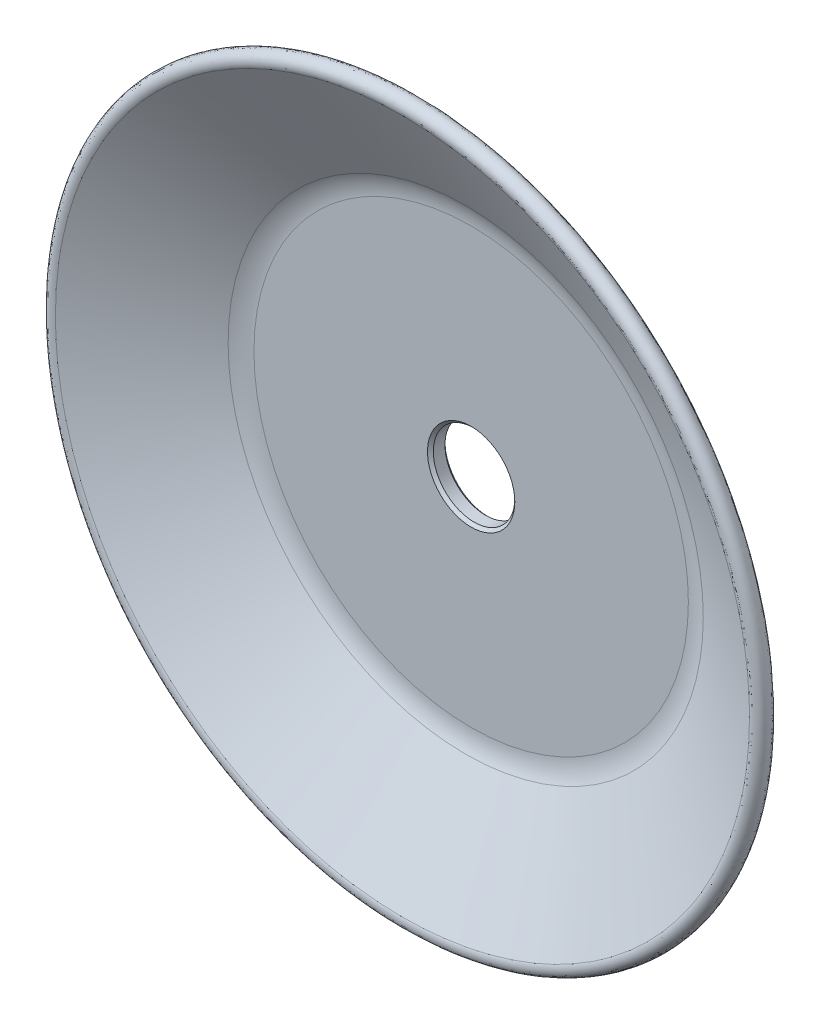
ISO-10303-21;
HEADER;
FILE_DESCRIPTION(('STEP AP214'),'2;1');
FILE_NAME('part.step','',(''),(''),'','','');
FILE_SCHEMA(('AUTOMOTIVE_DESIGN { 1 0 10303 214 1 1 1 1 }'));
ENDSEC;
DATA;
#1=APPLICATION_CONTEXT('core data for automotive mechanical design processes');
#2=APPLICATION_PROTOCOL_DEFINITION('international standard','automotive_design',2000,#1);
#3=PRODUCT_CONTEXT('',#1,'mechanical');
#4=PRODUCT('Part','Part','',(#3));
#5=PRODUCT_RELATED_PRODUCT_CATEGORY('part','',(#4));
#6=PRODUCT_DEFINITION_FORMATION('','',#4);
#7=PRODUCT_DEFINITION_CONTEXT('part definition',#1,'design');
#8=PRODUCT_DEFINITION('design','',#6,#7);
#9=PRODUCT_DEFINITION_SHAPE('','',#8);
#10=(LENGTH_UNIT() NAMED_UNIT(*) SI_UNIT(.MILLI.,.METRE.));
#11=(NAMED_UNIT(*) PLANE_ANGLE_UNIT() SI_UNIT($,.RADIAN.));
#12=(NAMED_UNIT(*) SI_UNIT($,.STERADIAN.) SOLID_ANGLE_UNIT());
#13=UNCERTAINTY_MEASURE_WITH_UNIT(LENGTH_MEASURE(1.E-05),#10,'distance_accuracy_value','');
#14=(GEOMETRIC_REPRESENTATION_CONTEXT(3) GLOBAL_UNCERTAINTY_ASSIGNED_CONTEXT((#13)) GLOBAL_UNIT_ASSIGNED_CONTEXT((#10,
#11,#12)) REPRESENTATION_CONTEXT('',''));
#15=CARTESIAN_POINT('',(0.,0.,0.));
#16=DIRECTION('',(0.,0.,1.));
#17=DIRECTION('',(1.,0.,0.));
#18=AXIS2_PLACEMENT_3D('',#15,#16,#17);
#19=CARTESIAN_POINT('',(-59.6326859021799,-3.25001168292347E-12,14.7990381056767));
#20=CARTESIAN_POINT('',(-59.6326859021768,-7.80532372691678,14.7990381056751));
#21=CARTESIAN_POINT('',(-58.0803860482153,-15.6092620862819,14.7990381056677));
#22=CARTESIAN_POINT('',(-52.1064498991789,-30.0316197581151,14.7990381056856));
#23=CARTESIAN_POINT('',(-47.6858739185271,-36.6474792450666,14.7990381056748));
#24=CARTESIAN_POINT('',(-36.6474792450661,-47.6858739185356,14.7990381056785));
#25=CARTESIAN_POINT('',(-30.0316197582012,-52.1064498991463,14.7990381056867));
#26=CARTESIAN_POINT('',(-15.6092620861839,-58.0803860482529,14.7990381056666));
#27=CARTESIAN_POINT('',(-7.80532372701427,-59.6326859021829,14.7990381056782));
#28=CARTESIAN_POINT('',(7.80532372702071,-59.6326859021768,14.7990381056751));
#29=CARTESIAN_POINT('',(15.6092620861864,-58.0803860482693,14.7990381056754));
#30=CARTESIAN_POINT('',(30.0316197582106,-52.1064498991249,14.7990381056779));
#31=CARTESIAN_POINT('',(36.6474792451761,-47.6858739183642,14.799038105653));
#32=CARTESIAN_POINT('',(47.6858739184261,-36.647479245229,14.7990381057003));
#33=CARTESIAN_POINT('',(52.1064498991436,-30.0316197582001,14.799038105685));
#34=CARTESIAN_POINT('',(58.0803860482556,-15.609262086185,14.7990381056683));
#35=CARTESIAN_POINT('',(59.6326859021829,-7.80532372697825,14.7990381056782));
#36=CARTESIAN_POINT('',(59.6326859021768,7.80532372698474,14.7990381056751));
#37=CARTESIAN_POINT('',(58.0803860482192,15.6092620862699,14.7990381056672));
#38=CARTESIAN_POINT('',(52.106449899175,30.0316197581271,14.7990381056861));
#39=CARTESIAN_POINT('',(47.6858739184794,36.6474792450734,14.7990381056581));
#40=CARTESIAN_POINT('',(36.6474792451137,47.6858739185288,14.7990381056952));
#41=CARTESIAN_POINT('',(30.0316197581487,52.1064498991511,14.7990381056777));
#42=CARTESIAN_POINT('',(15.6092620862363,58.0803860482481,14.7990381056756));
#43=CARTESIAN_POINT('',(7.80532372691029,59.63268590218,14.7990381056765));
#44=CARTESIAN_POINT('',(-7.80532372691677,59.6326859021798,14.7990381056768));
#45=CARTESIAN_POINT('',(-15.609262086271,58.080386048222,14.7990381056689));
#46=CARTESIAN_POINT('',(-30.0316197581259,52.1064498991723,14.7990381056844));
#47=CARTESIAN_POINT('',(-36.6474792451483,47.6858739184453,14.7990381056748));
#48=CARTESIAN_POINT('',(-47.6858739184539,36.6474792451478,14.7990381056785));
#49=CARTESIAN_POINT('',(-52.106449899175,30.03161975812,14.7990381056841));
#50=CARTESIAN_POINT('',(-58.0803860482242,15.609262086265,14.7990381056692));
#51=CARTESIAN_POINT('',(-59.6326859021829,7.80532372691028,14.7990381056782));
#52=CARTESIAN_POINT('',(-59.6326859021799,-3.25001168292347E-12,14.7990381056767));
#53=CARTESIAN_POINT('',(-60.4987113059643,-3.28289302831085E-12,15.2990381056767));
#54=CARTESIAN_POINT('',(-60.4987113059916,-7.92012047050818,15.2990381056426));
#55=CARTESIAN_POINT('',(-58.9244200052748,-15.8346172985172,15.2990381056562));
#56=CARTESIAN_POINT('',(-52.8626222325019,-30.4690916939511,15.2990381056971));
#57=CARTESIAN_POINT('',(-48.379419910053,-37.1786781249908,15.2990381056426));
#58=CARTESIAN_POINT('',(-37.1786781249317,-48.3794199100031,15.2990381057107));
#59=CARTESIAN_POINT('',(-30.4690916939587,-52.8626222325317,15.2990381056562));
#60=CARTESIAN_POINT('',(-15.8346172984975,-58.9244200052501,15.2990381056971));
#61=CARTESIAN_POINT('',(-7.92012047048553,-60.4987113059371,15.2990381057039));
#62=CARTESIAN_POINT('',(7.9201204704921,-60.4987113059916,15.2990381056494));
#63=CARTESIAN_POINT('',(15.8346172985581,-58.9244200052203,15.2990381056562));
#64=CARTESIAN_POINT('',(30.4690916939102,-52.8626222325564,15.2990381056971));
#65=CARTESIAN_POINT('',(37.1786781249908,-48.3794199100529,15.2990381055677));
#66=CARTESIAN_POINT('',(48.3794199100031,-37.1786781249317,15.2990381057856));
#67=CARTESIAN_POINT('',(52.8626222325045,-30.469091693945,15.299038105663));
#68=CARTESIAN_POINT('',(58.9244200052773,-15.8346172985111,15.2990381056903));
#69=CARTESIAN_POINT('',(60.4987113059643,-7.92012047049109,15.2990381056835));
#70=CARTESIAN_POINT('',(60.4987113059643,7.92012047049767,15.2990381056698));
#71=CARTESIAN_POINT('',(58.9244200052748,15.8346172985172,15.2990381056494));
#72=CARTESIAN_POINT('',(52.8626222325019,30.4690916939511,15.2990381057039));
#73=CARTESIAN_POINT('',(48.3794199099984,37.1786781249636,15.299038105663));
#74=CARTESIAN_POINT('',(37.1786781249862,48.3794199100303,15.2990381056903));
#75=CARTESIAN_POINT('',(30.4690916939859,52.8626222325045,15.2990381056494));
#76=CARTESIAN_POINT('',(15.8346172984702,58.9244200052773,15.2990381057039));
#77=CARTESIAN_POINT('',(7.92012047050161,60.4987113059643,15.2990381056562));
#78=CARTESIAN_POINT('',(-7.92012047050819,60.4987113059643,15.2990381056971));
#79=CARTESIAN_POINT('',(-15.8346172984899,58.9244200053293,15.2990381056494));
#80=CARTESIAN_POINT('',(-30.4690916939783,52.8626222324475,15.2990381057039));
#81=CARTESIAN_POINT('',(-37.1786781250181,48.3794199100257,15.2990381056358));
#82=CARTESIAN_POINT('',(-48.3794199099759,37.1786781249589,15.2990381057175));
#83=CARTESIAN_POINT('',(-52.8626222325317,30.4690916939314,15.2990381056494));
#84=CARTESIAN_POINT('',(-58.9244200052501,15.8346172985247,15.2990381057039));
#85=CARTESIAN_POINT('',(-60.4987113059371,7.92012047050162,15.2990381057107));
#86=CARTESIAN_POINT('',(-60.4987113059643,-3.28289302831085E-12,15.2990381056767));
#87=CARTESIAN_POINT('',(-61.9562430606949,-3.34443240059446E-12,15.2745190528383));
#88=CARTESIAN_POINT('',(-61.9562430606404,-8.11332484810206,15.2745190527566));
#89=CARTESIAN_POINT('',(-60.344939875851,-16.2138929831594,15.2745190527906));
#90=CARTESIAN_POINT('',(-54.1352698742873,-31.2053625186719,15.274519052886));
#91=CARTESIAN_POINT('',(-49.5466666231042,-38.0726925871779,15.2745190527361));
#92=CARTESIAN_POINT('',(-38.0726925870097,-49.5466666229455,15.2745190529404));
#93=CARTESIAN_POINT('',(-31.2053625185567,-54.1352698743716,15.2745190527838));
#94=CARTESIAN_POINT('',(-16.2138929832621,-60.3449398757718,15.2745190528928));
#95=CARTESIAN_POINT('',(-8.1133248479032,-61.9562430606404,15.2745190529064));
#96=CARTESIAN_POINT('',(8.11332484790997,-61.9562430607493,15.2745190527702));
#97=CARTESIAN_POINT('',(16.2138929833229,-60.3449398755513,15.2745190527907));
#98=CARTESIAN_POINT('',(31.2053625185084,-54.135269874587,15.274519052886));
#99=CARTESIAN_POINT('',(38.0726925870145,-49.5466666233493,15.2745190525591));
#100=CARTESIAN_POINT('',(49.5466666231089,-38.0726925867645,15.2745190531175));
#101=CARTESIAN_POINT('',(54.1352698743172,-31.2053625185022,15.2745190528111));
#102=CARTESIAN_POINT('',(60.3449398758263,-16.2138929833166,15.2745190528655));
#103=CARTESIAN_POINT('',(61.9562430607494,-8.11332484797304,15.2745190528519));
#104=CARTESIAN_POINT('',(61.9562430606404,8.11332484797978,15.2745190528247));
#105=CARTESIAN_POINT('',(60.3449398759054,16.2138929831321,15.2745190527702));
#106=CARTESIAN_POINT('',(54.1352698742329,31.2053625186991,15.2745190529064));
#107=CARTESIAN_POINT('',(49.5466666231587,38.0726925870689,15.2745190527975));
#108=CARTESIAN_POINT('',(38.0726925869552,49.5466666230545,15.2745190528792));
#109=CARTESIAN_POINT('',(31.2053625186792,54.1352698743989,15.2745190527634));
#110=CARTESIAN_POINT('',(16.2138929831395,60.3449398757446,15.2745190529132));
#111=CARTESIAN_POINT('',(8.11332484809534,61.9562430606404,15.2745190527975));
#112=CARTESIAN_POINT('',(-8.11332484810208,61.9562430607494,15.2745190528792));
#113=CARTESIAN_POINT('',(-16.2138929830912,60.3449398759327,15.2745190527498));
#114=CARTESIAN_POINT('',(-31.2053625187399,54.1352698742056,15.2745190529268));
#115=CARTESIAN_POINT('',(-38.0726925869872,49.5466666231042,15.2745190527157));
#116=CARTESIAN_POINT('',(-49.5466666231362,38.0726925870097,15.2745190529609));
#117=CARTESIAN_POINT('',(-54.1352698743444,31.2053625186247,15.2745190527838));
#118=CARTESIAN_POINT('',(-60.3449398757991,16.213892983194,15.2745190528928));
#119=CARTESIAN_POINT('',(-61.9562430607493,8.11332484809537,15.27451905292));
#120=CARTESIAN_POINT('',(-61.9562430606949,-3.34443240059446E-12,15.2745190528383));
#121=CARTESIAN_POINT('',(-62.7062430606948,-3.38530778169319E-12,13.9754809471617));
#122=CARTESIAN_POINT('',(-62.7062430606948,-8.21274174431131,13.9754809470936));
#123=CARTESIAN_POINT('',(-61.0758947242928,-16.4090563218174,13.9754809471208));
#124=CARTESIAN_POINT('',(-54.7901343246124,-31.5842243285616,13.9754809472025));
#125=CARTESIAN_POINT('',(-50.1472950705333,-38.5327243115013,13.9754809469505));
#126=CARTESIAN_POINT('',(-38.5327243113604,-50.1472950704019,13.9754809473727));
#127=CARTESIAN_POINT('',(-31.5842243283646,-54.7901343246695,13.9754809471003));
#128=CARTESIAN_POINT('',(-16.4090563220017,-61.0758947242409,13.9754809472229));
#129=CARTESIAN_POINT('',(-8.21274174406039,-62.7062430606403,13.9754809472434));
#130=CARTESIAN_POINT('',(8.21274174406724,-62.7062430607493,13.97548094708));
#131=CARTESIAN_POINT('',(16.4090563220353,-61.0758947240204,13.9754809472434));
#132=CARTESIAN_POINT('',(31.5842243283437,-54.7901343248849,13.9754809470799));
#133=CARTESIAN_POINT('',(38.5327243112017,-50.1472950706422,13.975480946685));
#134=CARTESIAN_POINT('',(50.1472950707015,-38.5327243112514,13.9754809476384));
#135=CARTESIAN_POINT('',(54.7901343246423,-31.5842243283374,13.975480947182));
#136=CARTESIAN_POINT('',(61.0758947242681,-16.409056322029,13.9754809471412));
#137=CARTESIAN_POINT('',(62.7062430606949,-8.21274174415485,13.9754809471549));
#138=CARTESIAN_POINT('',(62.7062430606949,8.21274174416167,13.9754809471685));
#139=CARTESIAN_POINT('',(61.0758947242655,16.4090563218037,13.9754809470118));
#140=CARTESIAN_POINT('',(54.7901343246397,31.5842243285752,13.9754809473115));
#141=CARTESIAN_POINT('',(50.1472950704788,38.5327243114741,13.9754809469982));
#142=CARTESIAN_POINT('',(38.5327243114148,50.1472950704292,13.9754809473251));
#143=CARTESIAN_POINT('',(31.5842243285144,54.7901343246695,13.9754809469914));
#144=CARTESIAN_POINT('',(16.4090563218519,61.0758947242409,13.9754809473319));
#145=CARTESIAN_POINT('',(8.21274174430451,62.7062430606404,13.9754809471412));
#146=CARTESIAN_POINT('',(-8.21274174431133,62.7062430607494,13.9754809471821));
#147=CARTESIAN_POINT('',(-16.4090563217492,61.07589472432,13.975480947005));
#148=CARTESIAN_POINT('',(-31.5842243286296,54.7901343245852,13.9754809473183));
#149=CARTESIAN_POINT('',(-38.5327243113379,50.1472950704788,13.9754809469914));
#150=CARTESIAN_POINT('',(-50.1472950705654,38.5327243114149,13.9754809473319));
#151=CARTESIAN_POINT('',(-54.7901343246423,31.5842243284327,13.9754809471208));
#152=CARTESIAN_POINT('',(-61.0758947242681,16.4090563219336,13.9754809472025));
#153=CARTESIAN_POINT('',(-62.7062430606948,8.21274174430454,13.9754809472298));
#154=CARTESIAN_POINT('',(-62.7062430606948,-3.38530778169319E-12,13.9754809471617));
#155=CARTESIAN_POINT('',(-61.9987113059643,-3.36464379050832E-12,12.7009618943234));
#156=CARTESIAN_POINT('',(-61.9987113059098,-8.11895426292668,12.7009618942893));
#157=CARTESIAN_POINT('',(-60.3863297021583,-16.2249439758604,12.7009618942825));
#158=CARTESIAN_POINT('',(-54.1723511331521,-31.2268153137034,12.7009618943642));
#159=CARTESIAN_POINT('',(-49.5806768046387,-38.0987415737194,12.7009618941326));
#160=CARTESIAN_POINT('',(-38.0987415739054,-49.5806768048341,12.700961894514));
#161=CARTESIAN_POINT('',(-31.2268153135746,-54.1723511331002,12.7009618942893));
#162=CARTESIAN_POINT('',(-16.2249439759767,-60.3863297022154,12.7009618943574));
#163=CARTESIAN_POINT('',(-8.1189542627999,-61.9987113059643,12.700961894371));
#164=CARTESIAN_POINT('',(8.11895426280663,-61.9987113059643,12.7009618942757));
#165=CARTESIAN_POINT('',(16.2249439759966,-60.3863297021039,12.700961894405));
#166=CARTESIAN_POINT('',(31.2268153135672,-54.1723511332066,12.7009618942416));
#167=CARTESIAN_POINT('',(38.0987415735016,-49.580676804557,12.7009618938943));
#168=CARTESIAN_POINT('',(49.5806768050521,-38.0987415739871,12.7009618947524));
#169=CARTESIAN_POINT('',(54.1723511331275,-31.2268153135882,12.7009618943437));
#170=CARTESIAN_POINT('',(60.3863297021881,-16.2249439759631,12.7009618943029));
#171=CARTESIAN_POINT('',(61.9987113059916,-8.1189542628547,12.7009618943029));
#172=CARTESIAN_POINT('',(61.9987113059371,8.11895426286145,12.7009618943438));
#173=CARTESIAN_POINT('',(60.3863297021039,16.2249439758195,12.7009618941803));
#174=CARTESIAN_POINT('',(54.1723511332066,31.2268153137442,12.7009618944663));
#175=CARTESIAN_POINT('',(49.5806768046115,38.0987415737467,12.7009618941599));
#176=CARTESIAN_POINT('',(38.0987415739326,49.5806768048069,12.7009618944868));
#177=CARTESIAN_POINT('',(31.2268153136154,54.1723511330185,12.7009618941735));
#178=CARTESIAN_POINT('',(16.2249439759358,60.3863297022972,12.7009618944731));
#179=CARTESIAN_POINT('',(8.11895426291994,61.9987113059643,12.7009618943302));
#180=CARTESIAN_POINT('',(-8.11895426292668,61.9987113059643,12.7009618943165));
#181=CARTESIAN_POINT('',(-16.2249439757922,60.3863297021311,12.7009618941803));
#182=CARTESIAN_POINT('',(-31.2268153137714,54.1723511331794,12.7009618944663));
#183=CARTESIAN_POINT('',(-38.098741573665,49.5806768046659,12.7009618941735));
#184=CARTESIAN_POINT('',(-49.5806768048886,38.0987415738782,12.7009618944731));
#185=CARTESIAN_POINT('',(-54.1723511331002,31.226815313629,12.7009618943097));
#186=CARTESIAN_POINT('',(-60.3863297022154,16.2249439759222,12.7009618943369));
#187=CARTESIAN_POINT('',(-61.9987113060188,8.11895426291995,12.7009618943574));
#188=CARTESIAN_POINT('',(-61.9987113059643,-3.36464379050832E-12,12.7009618943234));
#189=CARTESIAN_POINT('',(-61.1326859021799,-3.33176244512093E-12,12.2009618943233));
#190=CARTESIAN_POINT('',(-61.1326859021271,-8.00415751933527,12.2009618942931));
#191=CARTESIAN_POINT('',(-59.5422957451054,-15.9995887636278,12.2009618942953));
#192=CARTESIAN_POINT('',(-53.4161787998226,-30.7893433778646,12.2009618943514));
#193=CARTESIAN_POINT('',(-48.8871308131177,-37.5675426937728,12.2009618942142));
#194=CARTESIAN_POINT('',(-37.5675426940349,-48.887130813389,12.2009618944324));
#195=CARTESIAN_POINT('',(-30.7893433778185,-53.4161787997456,12.2009618942996));
#196=CARTESIAN_POINT('',(-15.9995887636617,-59.5422957451875,12.2009618943471));
#197=CARTESIAN_POINT('',(-8.00415751932864,-61.1326859022063,12.2009618943384));
#198=CARTESIAN_POINT('',(8.00415751933524,-61.1326859021535,12.2009618943083));
#199=CARTESIAN_POINT('',(15.9995887636525,-59.5422957451809,12.200961894341));
#200=CARTESIAN_POINT('',(30.78934337784,-53.4161787997471,12.2009618943056));
#201=CARTESIAN_POINT('',(37.5675426936615,-48.8871308128429,12.2009618940566));
#202=CARTESIAN_POINT('',(48.8871308135004,-37.5675426943097,12.2009618945901));
#203=CARTESIAN_POINT('',(53.4161787997969,-30.7893433778445,12.2009618943327));
#204=CARTESIAN_POINT('',(59.5422957451361,-15.9995887636357,12.2009618943139));
#205=CARTESIAN_POINT('',(61.1326859021741,-8.00415751934186,12.2009618943198));
#206=CARTESIAN_POINT('',(61.1326859021857,8.00415751934852,12.2009618943269));
#207=CARTESIAN_POINT('',(59.5422957450214,15.9995887635724,12.2009618942383));
#208=CARTESIAN_POINT('',(53.4161787999066,30.78934337792,12.2009618944084));
#209=CARTESIAN_POINT('',(48.8871308130653,37.5675426938295,12.2009618942159));
#210=CARTESIAN_POINT('',(37.5675426940873,48.8871308133325,12.2009618944308));
#211=CARTESIAN_POINT('',(30.7893433777775,53.4161787996363,12.2009618942322));
#212=CARTESIAN_POINT('',(15.9995887637026,59.5422957452968,12.2009618944145));
#213=CARTESIAN_POINT('',(8.00415751932862,61.13268590218,12.2009618943232));
#214=CARTESIAN_POINT('',(-8.00415751933526,61.1326859021798,12.2009618943235));
#215=CARTESIAN_POINT('',(-15.9995887635701,59.542295745016,12.2009618942349));
#216=CARTESIAN_POINT('',(-30.7893433779223,53.416178799912,12.2009618944118));
#217=CARTESIAN_POINT('',(-37.5675426937967,48.8871308131143,12.2009618942225));
#218=CARTESIAN_POINT('',(-48.8871308133653,37.5675426940383,12.2009618944241));
#219=CARTESIAN_POINT('',(-53.4161787997712,30.7893433778315,12.2009618943161));
#220=CARTESIAN_POINT('',(-59.5422957451618,15.9995887636486,12.2009618943305));
#221=CARTESIAN_POINT('',(-61.1326859022327,8.00415751932861,12.2009618943536));
#222=CARTESIAN_POINT('',(-61.1326859021799,-3.33176244512093E-12,12.2009618943233));
#223=(BOUNDED_SURFACE() B_SPLINE_SURFACE(5,3,((#19,#20,#21,#22,#23,#24,#25,#26,#27,#28,#29,#30,
#31,#32,#33,#34,#35,#36,#37,#38,#39,#40,#41,#42,#43,#44,#45,#46,#47,#48,#49,#50,#51,#52),(#53,
#54,#55,#56,#57,#58,#59,#60,#61,#62,#63,#64,#65,#66,#67,#68,#69,#70,#71,#72,#73,#74,#75,#76,#77,
#78,#79,#80,#81,#82,#83,#84,#85,#86),(#87,#88,#89,#90,#91,#92,#93,#94,#95,#96,#97,#98,#99,#100,
#101,#102,#103,#104,#105,#106,#107,#108,#109,#110,#111,#112,#113,#114,#115,#116,#117,#118,#119,
#120),(#121,#122,#123,#124,#125,#126,#127,#128,#129,#130,#131,#132,#133,#134,#135,#136,#137,
#138,#139,#140,#141,#142,#143,#144,#145,#146,#147,#148,#149,#150,#151,#152,#153,#154),(#155,
#156,#157,#158,#159,#160,#161,#162,#163,#164,#165,#166,#167,#168,#169,#170,#171,#172,#173,#174,
#175,#176,#177,#178,#179,#180,#181,#182,#183,#184,#185,#186,#187,#188),(#189,#190,#191,#192,
#193,#194,#195,#196,#197,#198,#199,#200,#201,#202,#203,#204,#205,#206,#207,#208,#209,#210,#211,
#212,#213,#214,#215,#216,#217,#218,#219,#220,#221,#222)),.UNSPECIFIED.,.F.,.T.,
.F.) B_SPLINE_SURFACE_WITH_KNOTS((6,6),(4,2,2,2,2,2,2,2,2,2,2,2,2,2,2,2,4),(0.,1.),
(0.500000000000009,0.562500000000009,0.625000000000009,0.687500000000009,0.750000000000009,
0.812500000000009,0.875000000000009,0.937500000000009,1.00000000000001,1.06250000000001,
1.12500000000001,1.18750000000001,1.25000000000001,1.31250000000001,1.37500000000001,
1.43750000000001,1.50000000000001),
.UNSPECIFIED.) GEOMETRIC_REPRESENTATION_ITEM() RATIONAL_B_SPLINE_SURFACE(((1.,1.,1.,1.,1.,1.,1.,
1.,1.,1.,1.,1.,1.,1.,1.,1.,1.,1.,1.,1.,1.,1.,1.,1.,1.,1.,1.,1.,1.,1.,1.,1.,1.,1.),
(0.600000000000003,0.600000000000003,0.599999999999998,0.599999999999998,0.599999999999998,
0.599999999999998,0.599999999999997,0.599999999999997,0.600000000000004,0.600000000000004,
0.599999999999997,0.599999999999997,0.600000000000005,0.600000000000005,0.599999999999996,
0.599999999999996,0.6,0.6,0.599999999999999,0.599999999999999,0.599999999999998,
0.599999999999998,0.599999999999998,0.599999999999998,0.599999999999998,0.599999999999998,
0.599999999999999,0.599999999999999,0.599999999999997,0.599999999999997,0.599999999999998,
0.599999999999998,0.600000000000003,0.600000000000003),(0.400000000000005,0.400000000000005,
0.399999999999997,0.399999999999997,0.399999999999996,0.399999999999996,0.399999999999996,
0.399999999999996,0.400000000000006,0.400000000000006,0.399999999999996,0.399999999999996,
0.400000000000008,0.400000000000008,0.399999999999994,0.399999999999994,0.4,0.4,
0.399999999999999,0.399999999999999,0.399999999999998,0.399999999999998,0.399999999999997,
0.399999999999997,0.399999999999997,0.399999999999997,0.399999999999998,0.399999999999998,
0.399999999999995,0.399999999999995,0.399999999999997,0.399999999999997,0.400000000000005,
0.400000000000005),(0.400000000000005,0.400000000000005,0.399999999999997,0.399999999999997,
0.399999999999996,0.399999999999996,0.399999999999996,0.399999999999996,0.400000000000006,
0.400000000000006,0.399999999999996,0.399999999999996,0.400000000000008,0.400000000000008,
0.399999999999994,0.399999999999994,0.4,0.4,0.399999999999999,0.399999999999999,
0.399999999999998,0.399999999999998,0.399999999999997,0.399999999999997,0.399999999999997,
0.399999999999997,0.399999999999998,0.399999999999998,0.399999999999995,0.399999999999995,
0.399999999999997,0.399999999999997,0.400000000000005,0.400000000000005),(0.600000000000003,
0.600000000000003,0.599999999999998,0.599999999999998,0.599999999999998,0.599999999999998,
0.599999999999997,0.599999999999997,0.600000000000004,0.600000000000004,0.599999999999997,
0.599999999999997,0.600000000000005,0.600000000000005,0.599999999999996,0.599999999999996,0.6,
0.6,0.599999999999999,0.599999999999999,0.599999999999998,0.599999999999998,0.599999999999998,
0.599999999999998,0.599999999999998,0.599999999999998,0.599999999999999,0.599999999999999,
0.599999999999997,0.599999999999997,0.599999999999998,0.599999999999998,0.600000000000003,
0.600000000000003),(1.,1.,1.,1.,1.,1.,1.,1.,1.,1.,1.,1.,1.,1.,1.,1.,1.,1.,1.,1.,1.,1.,1.,1.,1.,
1.,1.,1.,1.,1.,1.,1.,1.,1.))) REPRESENTATION_ITEM('') SURFACE());
#224=CARTESIAN_POINT('',(-59.6326859021799,-3.25001168292347E-12,14.7990381056767));
#225=CARTESIAN_POINT('',(-59.6326859021829,7.80532372691028,14.7990381056782));
#226=CARTESIAN_POINT('',(-58.0803860482242,15.609262086265,14.7990381056692));
#227=CARTESIAN_POINT('',(-52.106449899175,30.03161975812,14.7990381056841));
#228=CARTESIAN_POINT('',(-47.6858739184539,36.6474792451478,14.7990381056785));
#229=CARTESIAN_POINT('',(-36.6474792451483,47.6858739184453,14.7990381056748));
#230=CARTESIAN_POINT('',(-30.0316197581259,52.1064498991723,14.7990381056844));
#231=CARTESIAN_POINT('',(-15.609262086271,58.080386048222,14.7990381056689));
#232=CARTESIAN_POINT('',(-7.80532372691677,59.6326859021798,14.7990381056768));
#233=CARTESIAN_POINT('',(7.80532372691029,59.63268590218,14.7990381056765));
#234=CARTESIAN_POINT('',(15.6092620862363,58.0803860482481,14.7990381056756));
#235=CARTESIAN_POINT('',(30.0316197581487,52.1064498991511,14.7990381056777));
#236=CARTESIAN_POINT('',(36.6474792451137,47.6858739185288,14.7990381056952));
#237=CARTESIAN_POINT('',(47.6858739184794,36.6474792450734,14.7990381056581));
#238=CARTESIAN_POINT('',(52.106449899175,30.0316197581271,14.7990381056861));
#239=CARTESIAN_POINT('',(58.0803860482192,15.6092620862699,14.7990381056672));
#240=CARTESIAN_POINT('',(59.6326859021768,7.80532372698474,14.7990381056751));
#241=CARTESIAN_POINT('',(59.6326859021829,-7.80532372697825,14.7990381056782));
#242=CARTESIAN_POINT('',(58.0803860482556,-15.609262086185,14.7990381056683));
#243=CARTESIAN_POINT('',(52.1064498991436,-30.0316197582001,14.799038105685));
#244=CARTESIAN_POINT('',(47.6858739184261,-36.647479245229,14.7990381057003));
#245=CARTESIAN_POINT('',(36.6474792451761,-47.6858739183642,14.799038105653));
#246=CARTESIAN_POINT('',(30.0316197582106,-52.1064498991249,14.7990381056779));
#247=CARTESIAN_POINT('',(15.6092620861864,-58.0803860482693,14.7990381056754));
#248=CARTESIAN_POINT('',(7.80532372702071,-59.6326859021768,14.7990381056751));
#249=CARTESIAN_POINT('',(-7.80532372701427,-59.6326859021829,14.7990381056782));
#250=CARTESIAN_POINT('',(-15.6092620861839,-58.0803860482529,14.7990381056666));
#251=CARTESIAN_POINT('',(-30.0316197582012,-52.1064498991463,14.7990381056867));
#252=CARTESIAN_POINT('',(-36.6474792450661,-47.6858739185356,14.7990381056785));
#253=CARTESIAN_POINT('',(-47.6858739185271,-36.6474792450666,14.7990381056748));
#254=CARTESIAN_POINT('',(-52.1064498991789,-30.0316197581151,14.7990381056856));
#255=CARTESIAN_POINT('',(-58.0803860482153,-15.6092620862819,14.7990381056677));
#256=CARTESIAN_POINT('',(-59.6326859021768,-7.80532372691678,14.7990381056751));
#257=CARTESIAN_POINT('',(-59.6326859021799,-3.25001168292347E-12,14.7990381056767));
#258=(BOUNDED_CURVE() B_SPLINE_CURVE(3,(#224,#225,#226,#227,#228,#229,#230,#231,#232,#233,#234,
#235,#236,#237,#238,#239,#240,#241,#242,#243,#244,#245,#246,#247,#248,#249,#250,#251,#252,#253,
#254,#255,#256,#257),.UNSPECIFIED.,.T.,.F.) B_SPLINE_CURVE_WITH_KNOTS((4,2,2,2,2,2,2,2,2,2,2,2,
2,2,2,2,4),(0.500000000000009,0.562500000000009,0.625000000000009,0.687500000000009,
0.750000000000009,0.812500000000009,0.875000000000009,0.937500000000009,1.00000000000001,
1.06250000000001,1.12500000000001,1.18750000000001,1.25000000000001,1.31250000000001,
1.37500000000001,1.43750000000001,1.50000000000001),
.UNSPECIFIED.) CURVE() GEOMETRIC_REPRESENTATION_ITEM() RATIONAL_B_SPLINE_CURVE((1.,1.,1.,1.,1.,
1.,1.,1.,1.,1.,1.,1.,1.,1.,1.,1.,1.,1.,1.,1.,1.,1.,1.,1.,1.,1.,1.,1.,1.,1.,1.,1.,1.,1.)) REPRESENTATION_ITEM(''));
#259=CARTESIAN_POINT('',(-59.6326859021799,-3.25001168292347E-12,14.7990381056767));
#260=VERTEX_POINT('',#259);
#261=EDGE_CURVE('E106',#260,#260,#258,.F.);
#262=CARTESIAN_POINT('',(-61.1326859021799,-3.33176244512093E-12,12.2009618943233));
#263=CARTESIAN_POINT('',(-61.1326859021271,-8.00415751933527,12.2009618942931));
#264=CARTESIAN_POINT('',(-59.5422957451054,-15.9995887636278,12.2009618942953));
#265=CARTESIAN_POINT('',(-53.4161787998226,-30.7893433778646,12.2009618943514));
#266=CARTESIAN_POINT('',(-48.8871308131177,-37.5675426937728,12.2009618942142));
#267=CARTESIAN_POINT('',(-37.5675426940349,-48.887130813389,12.2009618944324));
#268=CARTESIAN_POINT('',(-30.7893433778185,-53.4161787997456,12.2009618942996));
#269=CARTESIAN_POINT('',(-15.9995887636617,-59.5422957451875,12.2009618943471));
#270=CARTESIAN_POINT('',(-8.00415751932864,-61.1326859022063,12.2009618943384));
#271=CARTESIAN_POINT('',(8.00415751933524,-61.1326859021535,12.2009618943083));
#272=CARTESIAN_POINT('',(15.9995887636525,-59.5422957451809,12.200961894341));
#273=CARTESIAN_POINT('',(30.78934337784,-53.4161787997471,12.2009618943056));
#274=CARTESIAN_POINT('',(37.5675426936615,-48.8871308128429,12.2009618940566));
#275=CARTESIAN_POINT('',(48.8871308135004,-37.5675426943097,12.2009618945901));
#276=CARTESIAN_POINT('',(53.4161787997969,-30.7893433778445,12.2009618943327));
#277=CARTESIAN_POINT('',(59.5422957451361,-15.9995887636357,12.2009618943139));
#278=CARTESIAN_POINT('',(61.1326859021741,-8.00415751934186,12.2009618943198));
#279=CARTESIAN_POINT('',(61.1326859021857,8.00415751934852,12.2009618943269));
#280=CARTESIAN_POINT('',(59.5422957450214,15.9995887635724,12.2009618942383));
#281=CARTESIAN_POINT('',(53.4161787999066,30.78934337792,12.2009618944084));
#282=CARTESIAN_POINT('',(48.8871308130653,37.5675426938295,12.2009618942159));
#283=CARTESIAN_POINT('',(37.5675426940873,48.8871308133325,12.2009618944308));
#284=CARTESIAN_POINT('',(30.7893433777775,53.4161787996363,12.2009618942322));
#285=CARTESIAN_POINT('',(15.9995887637026,59.5422957452968,12.2009618944145));
#286=CARTESIAN_POINT('',(8.00415751932862,61.13268590218,12.2009618943232));
#287=CARTESIAN_POINT('',(-8.00415751933526,61.1326859021798,12.2009618943235));
#288=CARTESIAN_POINT('',(-15.9995887635701,59.542295745016,12.2009618942349));
#289=CARTESIAN_POINT('',(-30.7893433779223,53.416178799912,12.2009618944118));
#290=CARTESIAN_POINT('',(-37.5675426937967,48.8871308131143,12.2009618942225));
#291=CARTESIAN_POINT('',(-48.8871308133653,37.5675426940383,12.2009618944241));
#292=CARTESIAN_POINT('',(-53.4161787997712,30.7893433778315,12.2009618943161));
#293=CARTESIAN_POINT('',(-59.5422957451618,15.9995887636486,12.2009618943305));
#294=CARTESIAN_POINT('',(-61.1326859022327,8.00415751932861,12.2009618943536));
#295=CARTESIAN_POINT('',(-61.1326859021799,-3.33176244512093E-12,12.2009618943233));
#296=(BOUNDED_CURVE() B_SPLINE_CURVE(3,(#262,#263,#264,#265,#266,#267,#268,#269,#270,#271,#272,
#273,#274,#275,#276,#277,#278,#279,#280,#281,#282,#283,#284,#285,#286,#287,#288,#289,#290,#291,
#292,#293,#294,#295),.UNSPECIFIED.,.T.,.F.) B_SPLINE_CURVE_WITH_KNOTS((4,2,2,2,2,2,2,2,2,2,2,2,
2,2,2,2,4),(0.500000000000009,0.562500000000009,0.625000000000009,0.687500000000009,
0.750000000000009,0.812500000000009,0.875000000000009,0.937500000000009,1.00000000000001,
1.06250000000001,1.12500000000001,1.18750000000001,1.25000000000001,1.31250000000001,
1.37500000000001,1.43750000000001,1.50000000000001),
.UNSPECIFIED.) CURVE() GEOMETRIC_REPRESENTATION_ITEM() RATIONAL_B_SPLINE_CURVE((1.,1.,1.,1.,1.,
1.,1.,1.,1.,1.,1.,1.,1.,1.,1.,1.,1.,1.,1.,1.,1.,1.,1.,1.,1.,1.,1.,1.,1.,1.,1.,1.,1.,1.)) REPRESENTATION_ITEM(''));
#297=CARTESIAN_POINT('',(-61.1326859021799,-3.33176244512093E-12,12.2009618943233));
#298=VERTEX_POINT('',#297);
#299=EDGE_CURVE('E64',#298,#298,#296,.F.);
#300=ORIENTED_EDGE('',*,*,#261,.F.);
#301=EDGE_LOOP('',(#300));
#302=FACE_BOUND('',#301,.T.);
#303=ORIENTED_EDGE('',*,*,#299,.F.);
#304=EDGE_LOOP('',(#303));
#305=FACE_BOUND('',#304,.T.);
#306=ADVANCED_FACE('F43',(#302,#305),#223,.T.);
#307=CARTESIAN_POINT('',(0.,0.,0.));
#308=DIRECTION('',(0.,0.,1.));
#309=DIRECTION('',(1.,0.,0.));
#310=AXIS2_PLACEMENT_3D('',#307,#308,#309);
#311=CONICAL_SURFACE('',#310,40.,1.0471975511966);
#312=ORIENTED_EDGE('',*,*,#299,.T.);
#313=EDGE_LOOP('',(#312));
#314=FACE_BOUND('',#313,.T.);
#315=CARTESIAN_POINT('',(0.,0.,1.3397459621556));
#316=DIRECTION('',(0.,0.,-1.));
#317=DIRECTION('',(-1.,0.,0.));
#318=AXIS2_PLACEMENT_3D('',#315,#316,#317);
#319=CIRCLE('',#318,42.3205080756888);
#320=CARTESIAN_POINT('',(-42.3205080756888,0.,1.3397459621556));
#321=VERTEX_POINT('',#320);
#322=EDGE_CURVE('E149',#321,#321,#319,.F.);
#323=ORIENTED_EDGE('',*,*,#322,.T.);
#324=EDGE_LOOP('',(#323));
#325=FACE_BOUND('',#324,.T.);
#326=ADVANCED_FACE('F84',(#314,#325),#311,.T.);
#327=CARTESIAN_POINT('',(0.,0.,0.));
#328=DIRECTION('',(0.,0.,1.));
#329=DIRECTION('',(1.,0.,0.));
#330=AXIS2_PLACEMENT_3D('',#327,#328,#329);
#331=PLANE('',#330);
#332=CARTESIAN_POINT('',(0.,0.,0.));
#333=DIRECTION('',(0.,0.,1.));
#334=DIRECTION('',(1.,0.,0.));
#335=AXIS2_PLACEMENT_3D('',#332,#333,#334);
#336=CIRCLE('',#335,7.49999999999999);
#337=CARTESIAN_POINT('',(7.49999999999999,0.,0.));
#338=VERTEX_POINT('',#337);
#339=EDGE_CURVE('E10',#338,#338,#336,.T.);
#340=ORIENTED_EDGE('',*,*,#339,.T.);
#341=EDGE_LOOP('',(#340));
#342=FACE_BOUND('',#341,.T.);
#343=CARTESIAN_POINT('',(0.,0.,0.));
#344=DIRECTION('',(0.,0.,1.));
#345=DIRECTION('',(1.,0.,0.));
#346=AXIS2_PLACEMENT_3D('',#343,#344,#345);
#347=CIRCLE('',#346,37.3205080756888);
#348=CARTESIAN_POINT('',(37.3205080756888,0.,0.));
#349=VERTEX_POINT('',#348);
#350=EDGE_CURVE('E146',#349,#349,#347,.F.);
#351=ORIENTED_EDGE('',*,*,#350,.T.);
#352=EDGE_LOOP('',(#351));
#353=FACE_BOUND('',#352,.T.);
#354=ADVANCED_FACE('F120',(#342,#353),#331,.F.);
#355=CARTESIAN_POINT('',(0.,0.,10.));
#356=DIRECTION('',(0.,0.,1.));
#357=DIRECTION('',(1.,0.,0.));
#358=AXIS2_PLACEMENT_3D('',#355,#356,#357);
#359=TOROIDAL_SURFACE('',#358,37.3205080756888,10.);
#360=ORIENTED_EDGE('',*,*,#350,.F.);
#361=EDGE_LOOP('',(#360));
#362=FACE_BOUND('',#361,.T.);
#363=ORIENTED_EDGE('',*,*,#322,.F.);
#364=EDGE_LOOP('',(#363));
#365=FACE_BOUND('',#364,.T.);
#366=ADVANCED_FACE('F86',(#362,#365),#359,.T.);
#367=CARTESIAN_POINT('',(0.,0.,2.59807621135332));
#368=DIRECTION('',(0.,0.,1.));
#369=DIRECTION('',(1.,0.,0.));
#370=AXIS2_PLACEMENT_3D('',#367,#368,#369);
#371=CONICAL_SURFACE('',#370,38.5,1.0471975511966);
#372=ORIENTED_EDGE('',*,*,#261,.T.);
#373=EDGE_LOOP('',(#372));
#374=FACE_BOUND('',#373,.T.);
#375=CARTESIAN_POINT('',(0.,0.,3.93782217350892));
#376=DIRECTION('',(0.,0.,1.));
#377=DIRECTION('',(1.,0.,0.));
#378=AXIS2_PLACEMENT_3D('',#375,#376,#377);
#379=CIRCLE('',#378,40.8205080756888);
#380=CARTESIAN_POINT('',(40.8205080756888,0.,3.93782217350892));
#381=VERTEX_POINT('',#380);
#382=EDGE_CURVE('E155',#381,#381,#379,.T.);
#383=ORIENTED_EDGE('',*,*,#382,.F.);
#384=EDGE_LOOP('',(#383));
#385=FACE_BOUND('',#384,.T.);
#386=ADVANCED_FACE('F132',(#374,#385),#371,.F.);
#387=CARTESIAN_POINT('',(0.,0.,3.));
#388=DIRECTION('',(0.,0.,1.));
#389=DIRECTION('',(1.,0.,0.));
#390=AXIS2_PLACEMENT_3D('',#387,#388,#389);
#391=PLANE('',#390);
#392=CARTESIAN_POINT('',(0.,0.,3.));
#393=DIRECTION('',(0.,0.,1.));
#394=DIRECTION('',(1.,0.,0.));
#395=AXIS2_PLACEMENT_3D('',#392,#393,#394);
#396=CIRCLE('',#395,7.49999999999998);
#397=CARTESIAN_POINT('',(7.49999999999998,0.,3.));
#398=VERTEX_POINT('',#397);
#399=EDGE_CURVE('E51',#398,#398,#396,.F.);
#400=ORIENTED_EDGE('',*,*,#399,.T.);
#401=EDGE_LOOP('',(#400));
#402=FACE_BOUND('',#401,.T.);
#403=CARTESIAN_POINT('',(0.,0.,3.));
#404=DIRECTION('',(0.,0.,1.));
#405=DIRECTION('',(1.,0.,0.));
#406=AXIS2_PLACEMENT_3D('',#403,#404,#405);
#407=CIRCLE('',#406,37.3205080756888);
#408=CARTESIAN_POINT('',(37.3205080756888,0.,3.));
#409=VERTEX_POINT('',#408);
#410=EDGE_CURVE('E152',#409,#409,#407,.F.);
#411=ORIENTED_EDGE('',*,*,#410,.F.);
#412=EDGE_LOOP('',(#411));
#413=FACE_BOUND('',#412,.T.);
#414=ADVANCED_FACE('F128',(#402,#413),#391,.T.);
#415=CARTESIAN_POINT('',(0.,0.,10.));
#416=DIRECTION('',(0.,0.,1.));
#417=DIRECTION('',(1.,0.,0.));
#418=AXIS2_PLACEMENT_3D('',#415,#416,#417);
#419=TOROIDAL_SURFACE('',#418,37.3205080756888,7.);
#420=ORIENTED_EDGE('',*,*,#410,.T.);
#421=EDGE_LOOP('',(#420));
#422=FACE_BOUND('',#421,.T.);
#423=ORIENTED_EDGE('',*,*,#382,.T.);
#424=EDGE_LOOP('',(#423));
#425=FACE_BOUND('',#424,.T.);
#426=ADVANCED_FACE('F124',(#422,#425),#419,.F.);
#427=CARTESIAN_POINT('',(0.,0.,0.));
#428=DIRECTION('',(0.,0.,1.));
#429=DIRECTION('',(1.,0.,0.));
#430=AXIS2_PLACEMENT_3D('',#427,#428,#429);
#431=CYLINDRICAL_SURFACE('',#430,7.);
#432=CARTESIAN_POINT('',(0.,0.,2.5));
#433=DIRECTION('',(0.,0.,1.));
#434=DIRECTION('',(1.,0.,0.));
#435=AXIS2_PLACEMENT_3D('',#432,#433,#434);
#436=CIRCLE('',#435,7.);
#437=CARTESIAN_POINT('',(7.,0.,2.5));
#438=VERTEX_POINT('',#437);
#439=EDGE_CURVE('E55',#438,#438,#436,.T.);
#440=ORIENTED_EDGE('',*,*,#439,.T.);
#441=EDGE_LOOP('',(#440));
#442=FACE_BOUND('',#441,.T.);
#443=CARTESIAN_POINT('',(0.,0.,0.499999999999996));
#444=DIRECTION('',(0.,0.,1.));
#445=DIRECTION('',(1.,0.,0.));
#446=AXIS2_PLACEMENT_3D('',#443,#444,#445);
#447=CIRCLE('',#446,7.);
#448=CARTESIAN_POINT('',(7.,0.,0.499999999999996));
#449=VERTEX_POINT('',#448);
#450=EDGE_CURVE('E59',#449,#449,#447,.F.);
#451=ORIENTED_EDGE('',*,*,#450,.T.);
#452=EDGE_LOOP('',(#451));
#453=FACE_BOUND('',#452,.T.);
#454=ADVANCED_FACE('F127',(#442,#453),#431,.F.);
#455=CARTESIAN_POINT('',(0.,0.,2.5));
#456=DIRECTION('',(0.,0.,1.));
#457=DIRECTION('',(1.,0.,0.));
#458=AXIS2_PLACEMENT_3D('',#455,#456,#457);
#459=CONICAL_SURFACE('',#458,7.,0.785398163397424);
#460=ORIENTED_EDGE('',*,*,#399,.F.);
#461=EDGE_LOOP('',(#460));
#462=FACE_BOUND('',#461,.T.);
#463=ORIENTED_EDGE('',*,*,#439,.F.);
#464=EDGE_LOOP('',(#463));
#465=FACE_BOUND('',#464,.T.);
#466=ADVANCED_FACE('F88',(#462,#465),#459,.F.);
#467=CARTESIAN_POINT('',(0.,0.,0.));
#468=DIRECTION('',(0.,0.,-1.));
#469=DIRECTION('',(-1.,0.,0.));
#470=AXIS2_PLACEMENT_3D('',#467,#468,#469);
#471=CONICAL_SURFACE('',#470,7.49999999999999,0.785398163397445);
#472=ORIENTED_EDGE('',*,*,#450,.F.);
#473=EDGE_LOOP('',(#472));
#474=FACE_BOUND('',#473,.T.);
#475=ORIENTED_EDGE('',*,*,#339,.F.);
#476=EDGE_LOOP('',(#475));
#477=FACE_BOUND('',#476,.T.);
#478=ADVANCED_FACE('F46',(#474,#477),#471,.F.);
#479=CLOSED_SHELL('',(#306,#326,#354,#366,#386,#414,#426,#454,#466,#478));
#480=MANIFOLD_SOLID_BREP('B2',#479);
#481=ADVANCED_BREP_SHAPE_REPRESENTATION('',(#18,#480),#14);
#482=SHAPE_DEFINITION_REPRESENTATION(#9,#481);
ENDSEC;
END-ISO-10303-21;
